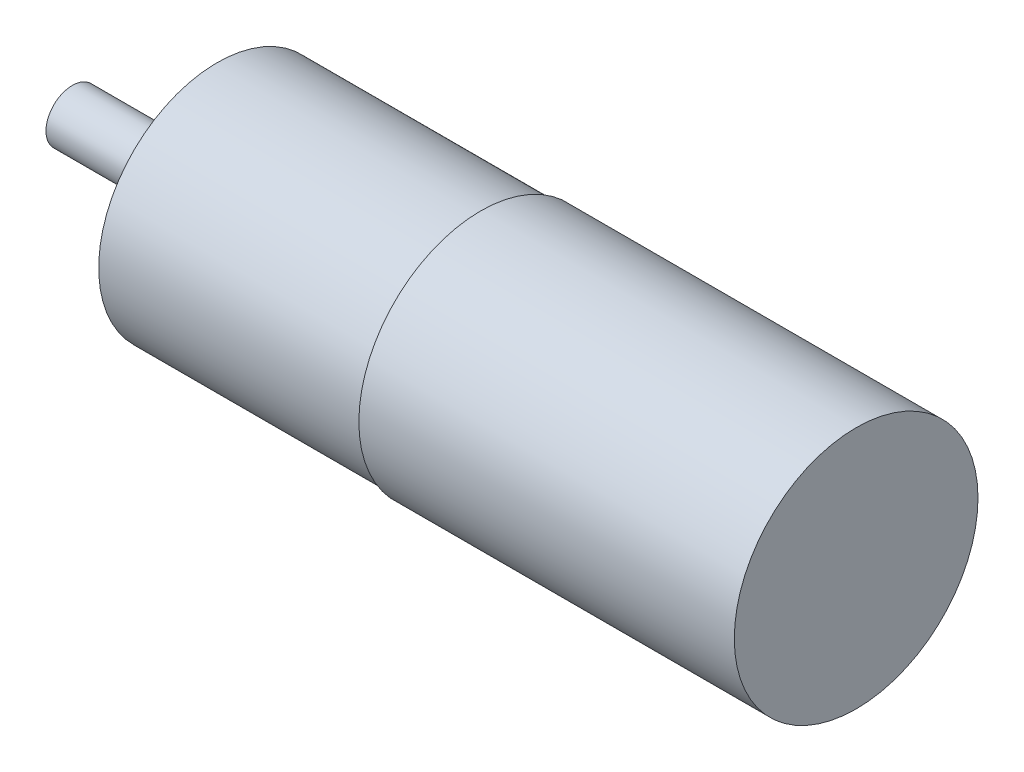
ISO-10303-21;
HEADER;
FILE_DESCRIPTION(('STEP AP214'),'2;1');
FILE_NAME('part.step','',(''),(''),'','','');
FILE_SCHEMA(('AUTOMOTIVE_DESIGN { 1 0 10303 214 1 1 1 1 }'));
ENDSEC;
DATA;
#1=APPLICATION_CONTEXT('core data for automotive mechanical design processes');
#2=APPLICATION_PROTOCOL_DEFINITION('international standard','automotive_design',2000,#1);
#3=PRODUCT_CONTEXT('',#1,'mechanical');
#4=PRODUCT('Part','Part','',(#3));
#5=PRODUCT_RELATED_PRODUCT_CATEGORY('part','',(#4));
#6=PRODUCT_DEFINITION_FORMATION('','',#4);
#7=PRODUCT_DEFINITION_CONTEXT('part definition',#1,'design');
#8=PRODUCT_DEFINITION('design','',#6,#7);
#9=PRODUCT_DEFINITION_SHAPE('','',#8);
#10=(LENGTH_UNIT() NAMED_UNIT(*) SI_UNIT(.MILLI.,.METRE.));
#11=(NAMED_UNIT(*) PLANE_ANGLE_UNIT() SI_UNIT($,.RADIAN.));
#12=(NAMED_UNIT(*) SI_UNIT($,.STERADIAN.) SOLID_ANGLE_UNIT());
#13=UNCERTAINTY_MEASURE_WITH_UNIT(LENGTH_MEASURE(1.E-05),#10,'distance_accuracy_value','');
#14=(GEOMETRIC_REPRESENTATION_CONTEXT(3) GLOBAL_UNCERTAINTY_ASSIGNED_CONTEXT((#13)) GLOBAL_UNIT_ASSIGNED_CONTEXT((#10,
#11,#12)) REPRESENTATION_CONTEXT('',''));
#15=CARTESIAN_POINT('',(0.,0.,0.));
#16=DIRECTION('',(0.,0.,1.));
#17=DIRECTION('',(1.,0.,0.));
#18=AXIS2_PLACEMENT_3D('',#15,#16,#17);
#19=CARTESIAN_POINT('',(40.,0.,0.));
#20=DIRECTION('',(-1.,0.,0.));
#21=DIRECTION('',(0.,0.,1.));
#22=AXIS2_PLACEMENT_3D('',#19,#20,#21);
#23=CYLINDRICAL_SURFACE('',#22,18.);
#24=CARTESIAN_POINT('',(40.,0.,0.));
#25=DIRECTION('',(1.,0.,0.));
#26=DIRECTION('',(0.,0.,-1.));
#27=AXIS2_PLACEMENT_3D('',#24,#25,#26);
#28=CIRCLE('',#27,18.);
#29=CARTESIAN_POINT('',(40.,0.,-18.));
#30=VERTEX_POINT('',#29);
#31=EDGE_CURVE('E87',#30,#30,#28,.T.);
#32=ORIENTED_EDGE('',*,*,#31,.F.);
#33=EDGE_LOOP('',(#32));
#34=FACE_BOUND('',#33,.T.);
#35=CARTESIAN_POINT('',(0.,0.,0.));
#36=DIRECTION('',(1.,0.,0.));
#37=DIRECTION('',(0.,0.,-1.));
#38=AXIS2_PLACEMENT_3D('',#35,#36,#37);
#39=CIRCLE('',#38,18.);
#40=CARTESIAN_POINT('',(0.,0.,-18.));
#41=VERTEX_POINT('',#40);
#42=EDGE_CURVE('E36',#41,#41,#39,.T.);
#43=ORIENTED_EDGE('',*,*,#42,.T.);
#44=EDGE_LOOP('',(#43));
#45=FACE_BOUND('',#44,.T.);
#46=ADVANCED_FACE('F33',(#34,#45),#23,.T.);
#47=CARTESIAN_POINT('',(0.,0.,0.));
#48=DIRECTION('',(1.,0.,0.));
#49=DIRECTION('',(0.,0.,-1.));
#50=AXIS2_PLACEMENT_3D('',#47,#48,#49);
#51=PLANE('',#50);
#52=CARTESIAN_POINT('',(0.,14.,0.));
#53=DIRECTION('',(-1.,0.,0.));
#54=DIRECTION('',(0.,-1.,0.));
#55=AXIS2_PLACEMENT_3D('',#52,#53,#54);
#56=CIRCLE('',#55,1.5);
#57=CARTESIAN_POINT('',(0.,12.5,0.));
#58=VERTEX_POINT('',#57);
#59=EDGE_CURVE('E181',#58,#58,#56,.T.);
#60=ORIENTED_EDGE('',*,*,#59,.F.);
#61=EDGE_LOOP('',(#60));
#62=FACE_BOUND('',#61,.T.);
#63=CARTESIAN_POINT('',(0.,0.,14.));
#64=DIRECTION('',(-1.,0.,0.));
#65=DIRECTION('',(0.,0.,-1.));
#66=AXIS2_PLACEMENT_3D('',#63,#64,#65);
#67=CIRCLE('',#66,1.5);
#68=CARTESIAN_POINT('',(0.,0.,12.5));
#69=VERTEX_POINT('',#68);
#70=EDGE_CURVE('E187',#69,#69,#67,.T.);
#71=ORIENTED_EDGE('',*,*,#70,.F.);
#72=EDGE_LOOP('',(#71));
#73=FACE_BOUND('',#72,.T.);
#74=CARTESIAN_POINT('',(0.,-14.,-1.46642216231412E-13));
#75=DIRECTION('',(-1.,0.,0.));
#76=DIRECTION('',(0.,1.,0.));
#77=AXIS2_PLACEMENT_3D('',#74,#75,#76);
#78=CIRCLE('',#77,1.5);
#79=CARTESIAN_POINT('',(0.,-12.5,-1.30930550206617E-13));
#80=VERTEX_POINT('',#79);
#81=EDGE_CURVE('E73',#80,#80,#78,.T.);
#82=ORIENTED_EDGE('',*,*,#81,.F.);
#83=EDGE_LOOP('',(#82));
#84=FACE_BOUND('',#83,.T.);
#85=CARTESIAN_POINT('',(0.,0.,-14.));
#86=DIRECTION('',(-1.,0.,0.));
#87=DIRECTION('',(0.,0.,1.));
#88=AXIS2_PLACEMENT_3D('',#85,#86,#87);
#89=CIRCLE('',#88,1.5);
#90=CARTESIAN_POINT('',(0.,0.,-12.5));
#91=VERTEX_POINT('',#90);
#92=EDGE_CURVE('E82',#91,#91,#89,.T.);
#93=ORIENTED_EDGE('',*,*,#92,.F.);
#94=EDGE_LOOP('',(#93));
#95=FACE_BOUND('',#94,.T.);
#96=CARTESIAN_POINT('',(0.,0.,0.));
#97=DIRECTION('',(-1.,0.,0.));
#98=DIRECTION('',(0.,0.,1.));
#99=AXIS2_PLACEMENT_3D('',#96,#97,#98);
#100=CIRCLE('',#99,11.);
#101=CARTESIAN_POINT('',(0.,0.,11.));
#102=VERTEX_POINT('',#101);
#103=EDGE_CURVE('E41',#102,#102,#100,.T.);
#104=ORIENTED_EDGE('',*,*,#103,.F.);
#105=EDGE_LOOP('',(#104));
#106=FACE_BOUND('',#105,.T.);
#107=ORIENTED_EDGE('',*,*,#42,.F.);
#108=EDGE_LOOP('',(#107));
#109=FACE_BOUND('',#108,.T.);
#110=ADVANCED_FACE('F95',(#62,#73,#84,#95,#106,#109),#51,.F.);
#111=CARTESIAN_POINT('',(-2.,0.,0.));
#112=DIRECTION('',(1.,0.,0.));
#113=DIRECTION('',(0.,0.,-1.));
#114=AXIS2_PLACEMENT_3D('',#111,#112,#113);
#115=CYLINDRICAL_SURFACE('',#114,11.);
#116=CARTESIAN_POINT('',(-2.,0.,0.));
#117=DIRECTION('',(-1.,0.,0.));
#118=DIRECTION('',(0.,0.,1.));
#119=AXIS2_PLACEMENT_3D('',#116,#117,#118);
#120=CIRCLE('',#119,11.);
#121=CARTESIAN_POINT('',(-2.,0.,11.));
#122=VERTEX_POINT('',#121);
#123=EDGE_CURVE('E76',#122,#122,#120,.T.);
#124=ORIENTED_EDGE('',*,*,#123,.F.);
#125=EDGE_LOOP('',(#124));
#126=FACE_BOUND('',#125,.T.);
#127=ORIENTED_EDGE('',*,*,#103,.T.);
#128=EDGE_LOOP('',(#127));
#129=FACE_BOUND('',#128,.T.);
#130=ADVANCED_FACE('F97',(#126,#129),#115,.T.);
#131=CARTESIAN_POINT('',(-2.,0.,0.));
#132=DIRECTION('',(-1.,0.,0.));
#133=DIRECTION('',(0.,0.,1.));
#134=AXIS2_PLACEMENT_3D('',#131,#132,#133);
#135=PLANE('',#134);
#136=CARTESIAN_POINT('',(-2.,0.,0.));
#137=DIRECTION('',(-1.,0.,0.));
#138=DIRECTION('',(0.,0.,1.));
#139=AXIS2_PLACEMENT_3D('',#136,#137,#138);
#140=CIRCLE('',#139,4.);
#141=CARTESIAN_POINT('',(-2.,0.,4.));
#142=VERTEX_POINT('',#141);
#143=EDGE_CURVE('E11',#142,#142,#140,.T.);
#144=ORIENTED_EDGE('',*,*,#143,.F.);
#145=EDGE_LOOP('',(#144));
#146=FACE_BOUND('',#145,.T.);
#147=ORIENTED_EDGE('',*,*,#123,.T.);
#148=EDGE_LOOP('',(#147));
#149=FACE_BOUND('',#148,.T.);
#150=ADVANCED_FACE('F103',(#146,#149),#135,.T.);
#151=CARTESIAN_POINT('',(-22.,0.,0.));
#152=DIRECTION('',(1.,0.,0.));
#153=DIRECTION('',(0.,0.,-1.));
#154=AXIS2_PLACEMENT_3D('',#151,#152,#153);
#155=CYLINDRICAL_SURFACE('',#154,4.);
#156=CARTESIAN_POINT('',(-22.,0.,0.));
#157=DIRECTION('',(-1.,0.,0.));
#158=DIRECTION('',(0.,0.,1.));
#159=AXIS2_PLACEMENT_3D('',#156,#157,#158);
#160=CIRCLE('',#159,4.);
#161=CARTESIAN_POINT('',(-22.,-3.75365849631588,1.38204482309208));
#162=VERTEX_POINT('',#161);
#163=CARTESIAN_POINT('',(-22.,-1.3281371862115,-3.77306925653402));
#164=VERTEX_POINT('',#163);
#165=EDGE_CURVE('E72',#162,#164,#160,.T.);
#166=ORIENTED_EDGE('',*,*,#165,.F.);
#167=DIRECTION('',(-1.,0.,0.));
#168=VECTOR('',#167,1.);
#169=CARTESIAN_POINT('',(-7.,-3.75365849631588,1.38204482309208));
#170=LINE('',#169,#168);
#171=CARTESIAN_POINT('',(-7.,-3.75365849631588,1.38204482309208));
#172=VERTEX_POINT('',#171);
#173=EDGE_CURVE('E49',#172,#162,#170,.T.);
#174=ORIENTED_EDGE('',*,*,#173,.F.);
#175=CARTESIAN_POINT('',(-7.,0.,0.));
#176=DIRECTION('',(-1.,0.,0.));
#177=DIRECTION('',(0.,0.,1.));
#178=AXIS2_PLACEMENT_3D('',#175,#176,#177);
#179=CIRCLE('',#178,4.);
#180=CARTESIAN_POINT('',(-7.,-1.3281371862115,-3.77306925653402));
#181=VERTEX_POINT('',#180);
#182=EDGE_CURVE('E65',#181,#172,#179,.T.);
#183=ORIENTED_EDGE('',*,*,#182,.F.);
#184=DIRECTION('',(-1.,0.,0.));
#185=VECTOR('',#184,1.);
#186=CARTESIAN_POINT('',(-7.,-1.3281371862115,-3.77306925653402));
#187=LINE('',#186,#185);
#188=EDGE_CURVE('E55',#181,#164,#187,.T.);
#189=ORIENTED_EDGE('',*,*,#188,.T.);
#190=EDGE_LOOP('',(#166,#174,#183,#189));
#191=FACE_BOUND('',#190,.T.);
#192=ORIENTED_EDGE('',*,*,#143,.T.);
#193=EDGE_LOOP('',(#192));
#194=FACE_BOUND('',#193,.T.);
#195=ADVANCED_FACE('F70',(#191,#194),#155,.T.);
#196=CARTESIAN_POINT('',(-22.,0.,0.));
#197=DIRECTION('',(-1.,0.,0.));
#198=DIRECTION('',(0.,0.,1.));
#199=AXIS2_PLACEMENT_3D('',#196,#197,#198);
#200=PLANE('',#199);
#201=DIRECTION('',(0.,0.425737438655835,-0.904846745767906));
#202=VECTOR('',#201,1.);
#203=CARTESIAN_POINT('',(-22.,-1.3281371862115,-3.77306925653402));
#204=LINE('',#203,#202);
#205=EDGE_CURVE('E60',#162,#164,#204,.T.);
#206=ORIENTED_EDGE('',*,*,#205,.F.);
#207=ORIENTED_EDGE('',*,*,#165,.T.);
#208=EDGE_LOOP('',(#206,#207));
#209=FACE_BOUND('',#208,.T.);
#210=ADVANCED_FACE('F75',(#209),#200,.T.);
#211=CARTESIAN_POINT('',(5.,0.,-14.));
#212=DIRECTION('',(-1.,0.,0.));
#213=DIRECTION('',(0.,0.,1.));
#214=AXIS2_PLACEMENT_3D('',#211,#212,#213);
#215=CYLINDRICAL_SURFACE('',#214,1.5);
#216=CARTESIAN_POINT('',(5.,0.,-14.));
#217=DIRECTION('',(-1.,0.,0.));
#218=DIRECTION('',(0.,0.,1.));
#219=AXIS2_PLACEMENT_3D('',#216,#217,#218);
#220=CIRCLE('',#219,1.5);
#221=CARTESIAN_POINT('',(5.,0.,-12.5));
#222=VERTEX_POINT('',#221);
#223=EDGE_CURVE('E77',#222,#222,#220,.T.);
#224=ORIENTED_EDGE('',*,*,#223,.F.);
#225=EDGE_LOOP('',(#224));
#226=FACE_BOUND('',#225,.T.);
#227=ORIENTED_EDGE('',*,*,#92,.T.);
#228=EDGE_LOOP('',(#227));
#229=FACE_BOUND('',#228,.T.);
#230=ADVANCED_FACE('F117',(#226,#229),#215,.F.);
#231=CARTESIAN_POINT('',(5.,0.,-14.));
#232=DIRECTION('',(-1.,0.,0.));
#233=DIRECTION('',(0.,0.,1.));
#234=AXIS2_PLACEMENT_3D('',#231,#232,#233);
#235=PLANE('',#234);
#236=ORIENTED_EDGE('',*,*,#223,.T.);
#237=EDGE_LOOP('',(#236));
#238=FACE_BOUND('',#237,.T.);
#239=ADVANCED_FACE('F120',(#238),#235,.T.);
#240=CARTESIAN_POINT('',(5.,-14.,-1.46642216231412E-13));
#241=DIRECTION('',(-1.,0.,0.));
#242=DIRECTION('',(0.,0.,1.));
#243=AXIS2_PLACEMENT_3D('',#240,#241,#242);
#244=CYLINDRICAL_SURFACE('',#243,1.5);
#245=CARTESIAN_POINT('',(5.,-14.,-1.46642216231412E-13));
#246=DIRECTION('',(-1.,0.,0.));
#247=DIRECTION('',(0.,1.,0.));
#248=AXIS2_PLACEMENT_3D('',#245,#246,#247);
#249=CIRCLE('',#248,1.5);
#250=CARTESIAN_POINT('',(5.,-12.5,-1.30930550206617E-13));
#251=VERTEX_POINT('',#250);
#252=EDGE_CURVE('E190',#251,#251,#249,.T.);
#253=ORIENTED_EDGE('',*,*,#252,.F.);
#254=EDGE_LOOP('',(#253));
#255=FACE_BOUND('',#254,.T.);
#256=ORIENTED_EDGE('',*,*,#81,.T.);
#257=EDGE_LOOP('',(#256));
#258=FACE_BOUND('',#257,.T.);
#259=ADVANCED_FACE('F124',(#255,#258),#244,.F.);
#260=CARTESIAN_POINT('',(5.,-14.,-1.46642216231412E-13));
#261=DIRECTION('',(-1.,0.,0.));
#262=DIRECTION('',(0.,1.,0.));
#263=AXIS2_PLACEMENT_3D('',#260,#261,#262);
#264=PLANE('',#263);
#265=ORIENTED_EDGE('',*,*,#252,.T.);
#266=EDGE_LOOP('',(#265));
#267=FACE_BOUND('',#266,.T.);
#268=ADVANCED_FACE('F128',(#267),#264,.T.);
#269=CARTESIAN_POINT('',(5.,0.,14.));
#270=DIRECTION('',(-1.,0.,0.));
#271=DIRECTION('',(0.,0.,1.));
#272=AXIS2_PLACEMENT_3D('',#269,#270,#271);
#273=CYLINDRICAL_SURFACE('',#272,1.5);
#274=CARTESIAN_POINT('',(5.,0.,14.));
#275=DIRECTION('',(-1.,0.,0.));
#276=DIRECTION('',(0.,0.,-1.));
#277=AXIS2_PLACEMENT_3D('',#274,#275,#276);
#278=CIRCLE('',#277,1.5);
#279=CARTESIAN_POINT('',(5.,0.,12.5));
#280=VERTEX_POINT('',#279);
#281=EDGE_CURVE('E184',#280,#280,#278,.T.);
#282=ORIENTED_EDGE('',*,*,#281,.F.);
#283=EDGE_LOOP('',(#282));
#284=FACE_BOUND('',#283,.T.);
#285=ORIENTED_EDGE('',*,*,#70,.T.);
#286=EDGE_LOOP('',(#285));
#287=FACE_BOUND('',#286,.T.);
#288=ADVANCED_FACE('F132',(#284,#287),#273,.F.);
#289=CARTESIAN_POINT('',(5.,0.,14.));
#290=DIRECTION('',(-1.,0.,0.));
#291=DIRECTION('',(0.,0.,-1.));
#292=AXIS2_PLACEMENT_3D('',#289,#290,#291);
#293=PLANE('',#292);
#294=ORIENTED_EDGE('',*,*,#281,.T.);
#295=EDGE_LOOP('',(#294));
#296=FACE_BOUND('',#295,.T.);
#297=ADVANCED_FACE('F136',(#296),#293,.T.);
#298=CARTESIAN_POINT('',(5.,14.,0.));
#299=DIRECTION('',(-1.,0.,0.));
#300=DIRECTION('',(0.,0.,1.));
#301=AXIS2_PLACEMENT_3D('',#298,#299,#300);
#302=CYLINDRICAL_SURFACE('',#301,1.5);
#303=CARTESIAN_POINT('',(5.,14.,0.));
#304=DIRECTION('',(-1.,0.,0.));
#305=DIRECTION('',(0.,-1.,0.));
#306=AXIS2_PLACEMENT_3D('',#303,#304,#305);
#307=CIRCLE('',#306,1.5);
#308=CARTESIAN_POINT('',(5.,12.5,0.));
#309=VERTEX_POINT('',#308);
#310=EDGE_CURVE('E178',#309,#309,#307,.T.);
#311=ORIENTED_EDGE('',*,*,#310,.F.);
#312=EDGE_LOOP('',(#311));
#313=FACE_BOUND('',#312,.T.);
#314=ORIENTED_EDGE('',*,*,#59,.T.);
#315=EDGE_LOOP('',(#314));
#316=FACE_BOUND('',#315,.T.);
#317=ADVANCED_FACE('F140',(#313,#316),#302,.F.);
#318=CARTESIAN_POINT('',(5.,14.,0.));
#319=DIRECTION('',(-1.,0.,0.));
#320=DIRECTION('',(0.,-1.,0.));
#321=AXIS2_PLACEMENT_3D('',#318,#319,#320);
#322=PLANE('',#321);
#323=ORIENTED_EDGE('',*,*,#310,.T.);
#324=EDGE_LOOP('',(#323));
#325=FACE_BOUND('',#324,.T.);
#326=ADVANCED_FACE('F144',(#325),#322,.T.);
#327=CARTESIAN_POINT('',(-7.,-1.3281371862115,-3.77306925653402));
#328=DIRECTION('',(0.,0.904846745767906,0.425737438655835));
#329=DIRECTION('',(0.,-0.425737438655835,0.904846745767906));
#330=AXIS2_PLACEMENT_3D('',#327,#328,#329);
#331=PLANE('',#330);
#332=ORIENTED_EDGE('',*,*,#205,.T.);
#333=ORIENTED_EDGE('',*,*,#188,.F.);
#334=DIRECTION('',(0.,0.425737438655835,-0.904846745767906));
#335=VECTOR('',#334,1.);
#336=CARTESIAN_POINT('',(-7.,-1.3281371862115,-3.77306925653402));
#337=LINE('',#336,#335);
#338=EDGE_CURVE('E175',#172,#181,#337,.T.);
#339=ORIENTED_EDGE('',*,*,#338,.F.);
#340=ORIENTED_EDGE('',*,*,#173,.T.);
#341=EDGE_LOOP('',(#332,#333,#339,#340));
#342=FACE_BOUND('',#341,.T.);
#343=ADVANCED_FACE('F61',(#342),#331,.F.);
#344=CARTESIAN_POINT('',(-7.,0.,0.));
#345=DIRECTION('',(-1.,0.,0.));
#346=DIRECTION('',(0.,0.,1.));
#347=AXIS2_PLACEMENT_3D('',#344,#345,#346);
#348=PLANE('',#347);
#349=ORIENTED_EDGE('',*,*,#182,.T.);
#350=ORIENTED_EDGE('',*,*,#338,.T.);
#351=EDGE_LOOP('',(#349,#350));
#352=FACE_BOUND('',#351,.T.);
#353=ADVANCED_FACE('F151',(#352),#348,.T.);
#354=CARTESIAN_POINT('',(97.,0.,0.));
#355=DIRECTION('',(-1.,0.,0.));
#356=DIRECTION('',(0.,0.,1.));
#357=AXIS2_PLACEMENT_3D('',#354,#355,#356);
#358=CYLINDRICAL_SURFACE('',#357,18.5);
#359=CARTESIAN_POINT('',(97.,0.,0.));
#360=DIRECTION('',(1.,0.,0.));
#361=DIRECTION('',(0.,0.,-1.));
#362=AXIS2_PLACEMENT_3D('',#359,#360,#361);
#363=CIRCLE('',#362,18.5);
#364=CARTESIAN_POINT('',(97.,0.,18.5));
#365=VERTEX_POINT('',#364);
#366=EDGE_CURVE('E66',#365,#365,#363,.T.);
#367=CARTESIAN_POINT('',(40.,0.,0.));
#368=DIRECTION('',(1.,0.,0.));
#369=DIRECTION('',(0.,0.,-1.));
#370=AXIS2_PLACEMENT_3D('',#367,#368,#369);
#371=CIRCLE('',#370,18.5);
#372=CARTESIAN_POINT('',(40.,0.,18.5));
#373=VERTEX_POINT('',#372);
#374=EDGE_CURVE('E169',#373,#373,#371,.T.);
#375=CARTESIAN_POINT('',(97.,0.,18.5));
#376=CARTESIAN_POINT('',(96.40625,0.,18.5));
#377=CARTESIAN_POINT('',(95.8125,0.,18.5));
#378=CARTESIAN_POINT('',(94.625,0.,18.5));
#379=CARTESIAN_POINT('',(94.03125,0.,18.5));
#380=CARTESIAN_POINT('',(92.84375,0.,18.5));
#381=CARTESIAN_POINT('',(92.25,0.,18.5));
#382=CARTESIAN_POINT('',(91.0625,0.,18.5));
#383=CARTESIAN_POINT('',(90.46875,0.,18.5));
#384=CARTESIAN_POINT('',(89.28125,0.,18.5));
#385=CARTESIAN_POINT('',(88.6875,0.,18.5));
#386=CARTESIAN_POINT('',(87.5,0.,18.5));
#387=CARTESIAN_POINT('',(86.90625,0.,18.5));
#388=CARTESIAN_POINT('',(85.71875,0.,18.5));
#389=CARTESIAN_POINT('',(85.125,0.,18.5));
#390=CARTESIAN_POINT('',(83.9375,0.,18.5));
#391=CARTESIAN_POINT('',(83.34375,0.,18.5));
#392=CARTESIAN_POINT('',(82.15625,0.,18.5));
#393=CARTESIAN_POINT('',(81.5625,0.,18.5));
#394=CARTESIAN_POINT('',(80.375,0.,18.5));
#395=CARTESIAN_POINT('',(79.78125,0.,18.5));
#396=CARTESIAN_POINT('',(78.59375,0.,18.5));
#397=CARTESIAN_POINT('',(78.,0.,18.5));
#398=CARTESIAN_POINT('',(76.8125,0.,18.5));
#399=CARTESIAN_POINT('',(76.21875,0.,18.5));
#400=CARTESIAN_POINT('',(75.03125,0.,18.5));
#401=CARTESIAN_POINT('',(74.4375,0.,18.5));
#402=CARTESIAN_POINT('',(73.25,0.,18.5));
#403=CARTESIAN_POINT('',(72.65625,0.,18.5));
#404=CARTESIAN_POINT('',(71.46875,0.,18.5));
#405=CARTESIAN_POINT('',(70.875,0.,18.5));
#406=CARTESIAN_POINT('',(69.6875,0.,18.5));
#407=CARTESIAN_POINT('',(69.09375,0.,18.5));
#408=CARTESIAN_POINT('',(67.90625,0.,18.5));
#409=CARTESIAN_POINT('',(67.3125,0.,18.5));
#410=CARTESIAN_POINT('',(66.125,0.,18.5));
#411=CARTESIAN_POINT('',(65.53125,0.,18.5));
#412=CARTESIAN_POINT('',(64.34375,0.,18.5));
#413=CARTESIAN_POINT('',(63.75,0.,18.5));
#414=CARTESIAN_POINT('',(62.5625,0.,18.5));
#415=CARTESIAN_POINT('',(61.96875,0.,18.5));
#416=CARTESIAN_POINT('',(60.78125,0.,18.5));
#417=CARTESIAN_POINT('',(60.1875,0.,18.5));
#418=CARTESIAN_POINT('',(59.,0.,18.5));
#419=CARTESIAN_POINT('',(58.40625,0.,18.5));
#420=CARTESIAN_POINT('',(57.21875,0.,18.5));
#421=CARTESIAN_POINT('',(56.625,0.,18.5));
#422=CARTESIAN_POINT('',(55.4375,0.,18.5));
#423=CARTESIAN_POINT('',(54.84375,0.,18.5));
#424=CARTESIAN_POINT('',(53.65625,0.,18.5));
#425=CARTESIAN_POINT('',(53.0625,0.,18.5));
#426=CARTESIAN_POINT('',(51.875,0.,18.5));
#427=CARTESIAN_POINT('',(51.28125,0.,18.5));
#428=CARTESIAN_POINT('',(50.09375,0.,18.5));
#429=CARTESIAN_POINT('',(49.5,0.,18.5));
#430=CARTESIAN_POINT('',(48.3125,0.,18.5));
#431=CARTESIAN_POINT('',(47.71875,0.,18.5));
#432=CARTESIAN_POINT('',(46.53125,0.,18.5));
#433=CARTESIAN_POINT('',(45.9375,0.,18.5));
#434=CARTESIAN_POINT('',(44.75,0.,18.5));
#435=CARTESIAN_POINT('',(44.15625,0.,18.5));
#436=CARTESIAN_POINT('',(42.96875,0.,18.5));
#437=CARTESIAN_POINT('',(42.375,0.,18.5));
#438=CARTESIAN_POINT('',(41.1875,0.,18.5));
#439=CARTESIAN_POINT('',(40.59375,0.,18.5));
#440=CARTESIAN_POINT('',(40.,0.,18.5));
#441=B_SPLINE_CURVE_WITH_KNOTS('',3,(#375,#376,#377,#378,#379,#380,#381,#382,#383,#384,#385,
#386,#387,#388,#389,#390,#391,#392,#393,#394,#395,#396,#397,#398,#399,#400,#401,#402,#403,#404,
#405,#406,#407,#408,#409,#410,#411,#412,#413,#414,#415,#416,#417,#418,#419,#420,#421,#422,#423,
#424,#425,#426,#427,#428,#429,#430,#431,#432,#433,#434,#435,#436,#437,#438,#439,#440),
.UNSPECIFIED.,.F.,.F.,(4,2,2,2,2,2,2,2,2,2,2,2,2,2,2,2,2,2,2,2,2,2,2,2,2,2,2,2,2,2,2,2,4),(0.,
1.78125,3.5625,5.34374999999999,7.12499999999999,8.90624999999999,10.6875,12.46875,14.25,
16.03125,17.8125,19.59375,21.375,23.15625,24.9375,26.71875,28.5,30.28125,32.0625,33.84375,
35.625,37.40625,39.1875,40.96875,42.75,44.53125,46.3125,48.09375,49.875,51.65625,53.4375,
55.21875,57.),.UNSPECIFIED.);
#442=EDGE_CURVE('BSEAM154',#365,#373,#441,.T.);
#443=ORIENTED_EDGE('',*,*,#366,.F.);
#444=ORIENTED_EDGE('',*,*,#374,.T.);
#445=ORIENTED_EDGE('',*,*,#442,.T.);
#446=ORIENTED_EDGE('',*,*,#442,.F.);
#447=EDGE_LOOP('',(#443,#445,#444,#446));
#448=FACE_BOUND('',#447,.T.);
#449=ADVANCED_FACE('F154',(#448),#358,.T.);
#450=CARTESIAN_POINT('',(97.,0.,0.));
#451=DIRECTION('',(1.,0.,0.));
#452=DIRECTION('',(0.,0.,-1.));
#453=AXIS2_PLACEMENT_3D('',#450,#451,#452);
#454=PLANE('',#453);
#455=ORIENTED_EDGE('',*,*,#366,.T.);
#456=EDGE_LOOP('',(#455));
#457=FACE_BOUND('',#456,.T.);
#458=ADVANCED_FACE('F158',(#457),#454,.T.);
#459=CARTESIAN_POINT('',(40.,0.,0.));
#460=DIRECTION('',(1.,0.,0.));
#461=DIRECTION('',(0.,0.,-1.));
#462=AXIS2_PLACEMENT_3D('',#459,#460,#461);
#463=PLANE('',#462);
#464=ORIENTED_EDGE('',*,*,#31,.T.);
#465=EDGE_LOOP('',(#464));
#466=FACE_BOUND('',#465,.T.);
#467=ORIENTED_EDGE('',*,*,#374,.F.);
#468=EDGE_LOOP('',(#467));
#469=FACE_BOUND('',#468,.T.);
#470=ADVANCED_FACE('F160',(#466,#469),#463,.F.);
#471=CLOSED_SHELL('',(#46,#110,#130,#150,#195,#210,#230,#239,#259,#268,#288,#297,#317,#326,#343,
#353,#449,#458,#470));
#472=MANIFOLD_SOLID_BREP('B2',#471);
#473=ADVANCED_BREP_SHAPE_REPRESENTATION('',(#18,#472),#14);
#474=SHAPE_DEFINITION_REPRESENTATION(#9,#473);
ENDSEC;
END-ISO-10303-21;
